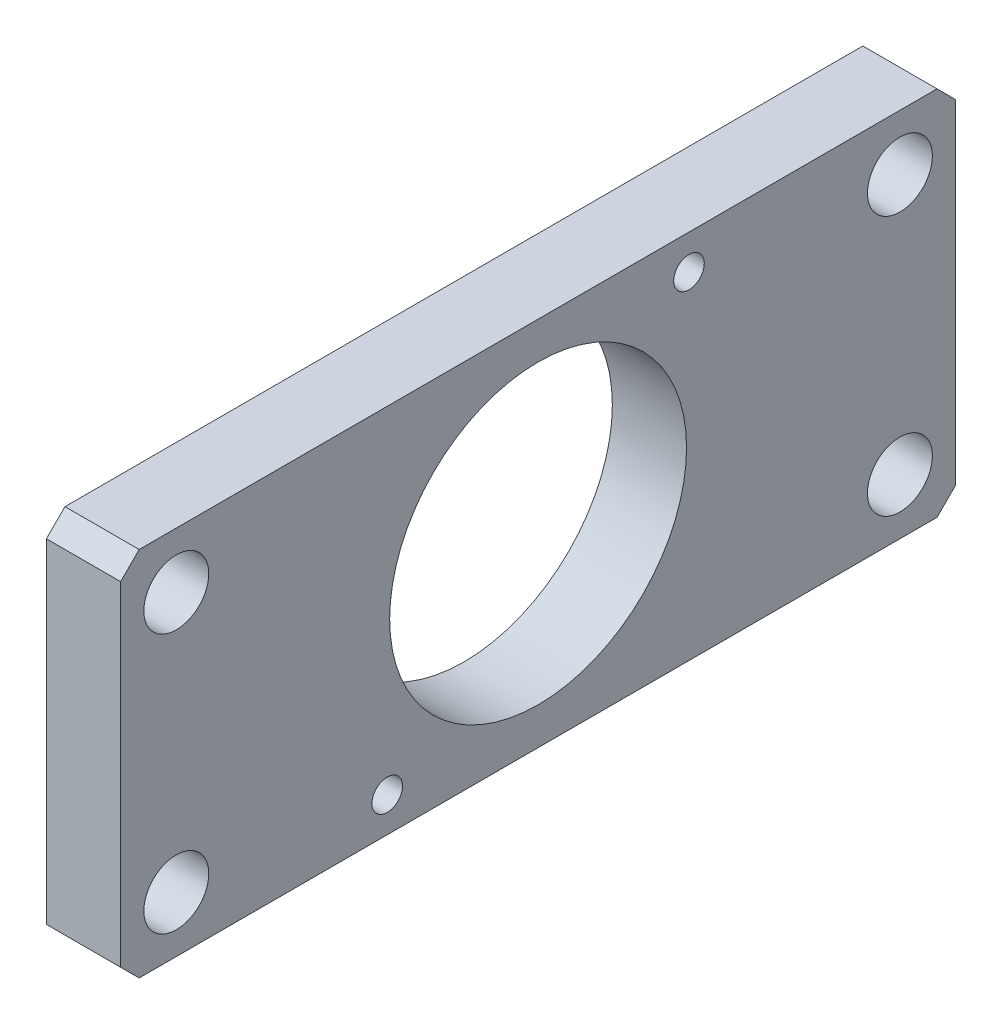
ISO-10303-21;
HEADER;
FILE_DESCRIPTION(('STEP AP214'),'2;1');
FILE_NAME('part.step','',(''),(''),'','','');
FILE_SCHEMA(('AUTOMOTIVE_DESIGN { 1 0 10303 214 1 1 1 1 }'));
ENDSEC;
DATA;
#1=APPLICATION_CONTEXT('core data for automotive mechanical design processes');
#2=APPLICATION_PROTOCOL_DEFINITION('international standard','automotive_design',2000,#1);
#3=PRODUCT_CONTEXT('',#1,'mechanical');
#4=PRODUCT('Part','Part','',(#3));
#5=PRODUCT_RELATED_PRODUCT_CATEGORY('part','',(#4));
#6=PRODUCT_DEFINITION_FORMATION('','',#4);
#7=PRODUCT_DEFINITION_CONTEXT('part definition',#1,'design');
#8=PRODUCT_DEFINITION('design','',#6,#7);
#9=PRODUCT_DEFINITION_SHAPE('','',#8);
#10=(LENGTH_UNIT() NAMED_UNIT(*) SI_UNIT(.MILLI.,.METRE.));
#11=(NAMED_UNIT(*) PLANE_ANGLE_UNIT() SI_UNIT($,.RADIAN.));
#12=(NAMED_UNIT(*) SI_UNIT($,.STERADIAN.) SOLID_ANGLE_UNIT());
#13=UNCERTAINTY_MEASURE_WITH_UNIT(LENGTH_MEASURE(1.E-05),#10,'distance_accuracy_value','');
#14=(GEOMETRIC_REPRESENTATION_CONTEXT(3) GLOBAL_UNCERTAINTY_ASSIGNED_CONTEXT((#13)) GLOBAL_UNIT_ASSIGNED_CONTEXT((#10,
#11,#12)) REPRESENTATION_CONTEXT('',''));
#15=CARTESIAN_POINT('',(0.,0.,0.));
#16=DIRECTION('',(0.,0.,1.));
#17=DIRECTION('',(1.,0.,0.));
#18=AXIS2_PLACEMENT_3D('',#15,#16,#17);
#19=CARTESIAN_POINT('',(8.,0.,-45.));
#20=DIRECTION('',(0.,0.,1.));
#21=DIRECTION('',(0.,-1.,0.));
#22=AXIS2_PLACEMENT_3D('',#19,#20,#21);
#23=PLANE('',#22);
#24=DIRECTION('',(0.,1.,0.));
#25=VECTOR('',#24,1.);
#26=CARTESIAN_POINT('',(8.,0.,-45.));
#27=LINE('',#26,#25);
#28=CARTESIAN_POINT('',(8.,2.,-45.));
#29=VERTEX_POINT('',#28);
#30=CARTESIAN_POINT('',(8.,38.,-45.));
#31=VERTEX_POINT('',#30);
#32=EDGE_CURVE('E126',#29,#31,#27,.T.);
#33=ORIENTED_EDGE('',*,*,#32,.F.);
#34=DIRECTION('',(-1.,0.,0.));
#35=VECTOR('',#34,1.);
#36=CARTESIAN_POINT('',(8.,2.,-45.));
#37=LINE('',#36,#35);
#38=CARTESIAN_POINT('',(0.,2.,-45.));
#39=VERTEX_POINT('',#38);
#40=EDGE_CURVE('E165',#29,#39,#37,.T.);
#41=ORIENTED_EDGE('',*,*,#40,.T.);
#42=DIRECTION('',(0.,1.,0.));
#43=VECTOR('',#42,1.);
#44=CARTESIAN_POINT('',(0.,0.,-45.));
#45=LINE('',#44,#43);
#46=CARTESIAN_POINT('',(0.,38.,-45.));
#47=VERTEX_POINT('',#46);
#48=EDGE_CURVE('E171',#39,#47,#45,.T.);
#49=ORIENTED_EDGE('',*,*,#48,.T.);
#50=DIRECTION('',(1.,0.,0.));
#51=VECTOR('',#50,1.);
#52=CARTESIAN_POINT('',(8.,38.,-45.));
#53=LINE('',#52,#51);
#54=EDGE_CURVE('E163',#47,#31,#53,.T.);
#55=ORIENTED_EDGE('',*,*,#54,.T.);
#56=EDGE_LOOP('',(#33,#41,#49,#55));
#57=FACE_BOUND('',#56,.T.);
#58=ADVANCED_FACE('F34',(#57),#23,.F.);
#59=CARTESIAN_POINT('',(8.,40.,-45.));
#60=DIRECTION('',(0.,-1.,0.));
#61=DIRECTION('',(0.,0.,-1.));
#62=AXIS2_PLACEMENT_3D('',#59,#60,#61);
#63=PLANE('',#62);
#64=DIRECTION('',(0.,0.,1.));
#65=VECTOR('',#64,1.);
#66=CARTESIAN_POINT('',(8.,40.,-45.));
#67=LINE('',#66,#65);
#68=CARTESIAN_POINT('',(8.,40.,-43.));
#69=VERTEX_POINT('',#68);
#70=CARTESIAN_POINT('',(8.,40.,43.));
#71=VERTEX_POINT('',#70);
#72=EDGE_CURVE('E129',#69,#71,#67,.T.);
#73=ORIENTED_EDGE('',*,*,#72,.F.);
#74=DIRECTION('',(-1.,0.,0.));
#75=VECTOR('',#74,1.);
#76=CARTESIAN_POINT('',(8.,40.,-43.));
#77=LINE('',#76,#75);
#78=CARTESIAN_POINT('',(0.,40.,-43.));
#79=VERTEX_POINT('',#78);
#80=EDGE_CURVE('E11',#69,#79,#77,.T.);
#81=ORIENTED_EDGE('',*,*,#80,.T.);
#82=DIRECTION('',(0.,0.,1.));
#83=VECTOR('',#82,1.);
#84=CARTESIAN_POINT('',(0.,40.,-45.));
#85=LINE('',#84,#83);
#86=CARTESIAN_POINT('',(0.,40.,43.));
#87=VERTEX_POINT('',#86);
#88=EDGE_CURVE('E131',#79,#87,#85,.T.);
#89=ORIENTED_EDGE('',*,*,#88,.T.);
#90=DIRECTION('',(1.,0.,0.));
#91=VECTOR('',#90,1.);
#92=CARTESIAN_POINT('',(8.,40.,43.));
#93=LINE('',#92,#91);
#94=EDGE_CURVE('E42',#87,#71,#93,.T.);
#95=ORIENTED_EDGE('',*,*,#94,.T.);
#96=EDGE_LOOP('',(#73,#81,#89,#95));
#97=FACE_BOUND('',#96,.T.);
#98=ADVANCED_FACE('F236',(#97),#63,.F.);
#99=CARTESIAN_POINT('',(8.,0.,45.));
#100=DIRECTION('',(0.,0.,-1.));
#101=DIRECTION('',(0.,1.,0.));
#102=AXIS2_PLACEMENT_3D('',#99,#100,#101);
#103=PLANE('',#102);
#104=DIRECTION('',(0.,-1.,0.));
#105=VECTOR('',#104,1.);
#106=CARTESIAN_POINT('',(0.,0.,45.));
#107=LINE('',#106,#105);
#108=CARTESIAN_POINT('',(0.,38.,45.));
#109=VERTEX_POINT('',#108);
#110=CARTESIAN_POINT('',(0.,1.99999999999999,45.));
#111=VERTEX_POINT('',#110);
#112=EDGE_CURVE('E127',#109,#111,#107,.T.);
#113=ORIENTED_EDGE('',*,*,#112,.T.);
#114=DIRECTION('',(1.,0.,0.));
#115=VECTOR('',#114,1.);
#116=CARTESIAN_POINT('',(8.,1.99999999999999,45.));
#117=LINE('',#116,#115);
#118=CARTESIAN_POINT('',(8.,1.99999999999999,45.));
#119=VERTEX_POINT('',#118);
#120=EDGE_CURVE('E105',#111,#119,#117,.T.);
#121=ORIENTED_EDGE('',*,*,#120,.T.);
#122=DIRECTION('',(0.,-1.,0.));
#123=VECTOR('',#122,1.);
#124=CARTESIAN_POINT('',(8.,0.,45.));
#125=LINE('',#124,#123);
#126=CARTESIAN_POINT('',(8.,38.,45.));
#127=VERTEX_POINT('',#126);
#128=EDGE_CURVE('E183',#127,#119,#125,.T.);
#129=ORIENTED_EDGE('',*,*,#128,.F.);
#130=DIRECTION('',(-1.,0.,0.));
#131=VECTOR('',#130,1.);
#132=CARTESIAN_POINT('',(8.,38.,45.));
#133=LINE('',#132,#131);
#134=EDGE_CURVE('E110',#127,#109,#133,.T.);
#135=ORIENTED_EDGE('',*,*,#134,.T.);
#136=EDGE_LOOP('',(#113,#121,#129,#135));
#137=FACE_BOUND('',#136,.T.);
#138=ADVANCED_FACE('F234',(#137),#103,.F.);
#139=CARTESIAN_POINT('',(8.,0.,-45.));
#140=DIRECTION('',(0.,1.,0.));
#141=DIRECTION('',(0.,0.,1.));
#142=AXIS2_PLACEMENT_3D('',#139,#140,#141);
#143=PLANE('',#142);
#144=DIRECTION('',(0.,0.,-1.));
#145=VECTOR('',#144,1.);
#146=CARTESIAN_POINT('',(8.,0.,-45.));
#147=LINE('',#146,#145);
#148=CARTESIAN_POINT('',(8.,0.,43.));
#149=VERTEX_POINT('',#148);
#150=CARTESIAN_POINT('',(8.,0.,-43.));
#151=VERTEX_POINT('',#150);
#152=EDGE_CURVE('E120',#149,#151,#147,.T.);
#153=ORIENTED_EDGE('',*,*,#152,.F.);
#154=DIRECTION('',(-1.,0.,0.));
#155=VECTOR('',#154,1.);
#156=CARTESIAN_POINT('',(8.,0.,43.));
#157=LINE('',#156,#155);
#158=CARTESIAN_POINT('',(0.,0.,43.));
#159=VERTEX_POINT('',#158);
#160=EDGE_CURVE('E104',#149,#159,#157,.T.);
#161=ORIENTED_EDGE('',*,*,#160,.T.);
#162=DIRECTION('',(0.,0.,-1.));
#163=VECTOR('',#162,1.);
#164=CARTESIAN_POINT('',(0.,0.,-45.));
#165=LINE('',#164,#163);
#166=CARTESIAN_POINT('',(0.,0.,-43.));
#167=VERTEX_POINT('',#166);
#168=EDGE_CURVE('E117',#159,#167,#165,.T.);
#169=ORIENTED_EDGE('',*,*,#168,.T.);
#170=DIRECTION('',(1.,0.,0.));
#171=VECTOR('',#170,1.);
#172=CARTESIAN_POINT('',(8.,0.,-43.));
#173=LINE('',#172,#171);
#174=EDGE_CURVE('E122',#167,#151,#173,.T.);
#175=ORIENTED_EDGE('',*,*,#174,.T.);
#176=EDGE_LOOP('',(#153,#161,#169,#175));
#177=FACE_BOUND('',#176,.T.);
#178=ADVANCED_FACE('F116',(#177),#143,.F.);
#179=CARTESIAN_POINT('',(8.,40.,-45.));
#180=DIRECTION('',(1.,0.,0.));
#181=DIRECTION('',(0.,0.,-1.));
#182=AXIS2_PLACEMENT_3D('',#179,#180,#181);
#183=PLANE('',#182);
#184=CARTESIAN_POINT('',(8.,36.2634559672907,-16.2634559672905));
#185=DIRECTION('',(1.,0.,0.));
#186=DIRECTION('',(0.,0.,-1.));
#187=AXIS2_PLACEMENT_3D('',#184,#185,#186);
#188=CIRCLE('',#187,1.64999999999999);
#189=CARTESIAN_POINT('',(8.,36.2634559672907,-17.9134559672905));
#190=VERTEX_POINT('',#189);
#191=EDGE_CURVE('E209',#190,#190,#188,.T.);
#192=ORIENTED_EDGE('',*,*,#191,.F.);
#193=EDGE_LOOP('',(#192));
#194=FACE_BOUND('',#193,.T.);
#195=CARTESIAN_POINT('',(8.,3.7365440327093,16.2634559672905));
#196=DIRECTION('',(1.,0.,0.));
#197=DIRECTION('',(0.,0.,-1.));
#198=AXIS2_PLACEMENT_3D('',#195,#196,#197);
#199=CIRCLE('',#198,1.64999999999999);
#200=CARTESIAN_POINT('',(8.,3.7365440327093,14.6134559672905));
#201=VERTEX_POINT('',#200);
#202=EDGE_CURVE('E203',#201,#201,#199,.T.);
#203=ORIENTED_EDGE('',*,*,#202,.F.);
#204=EDGE_LOOP('',(#203));
#205=FACE_BOUND('',#204,.T.);
#206=CARTESIAN_POINT('',(8.,5.99999999999998,39.));
#207=DIRECTION('',(1.,0.,0.));
#208=DIRECTION('',(0.,0.,-1.));
#209=AXIS2_PLACEMENT_3D('',#206,#207,#208);
#210=CIRCLE('',#209,3.49999999999999);
#211=CARTESIAN_POINT('',(8.,5.99999999999998,35.5));
#212=VERTEX_POINT('',#211);
#213=EDGE_CURVE('E147',#212,#212,#210,.T.);
#214=ORIENTED_EDGE('',*,*,#213,.F.);
#215=EDGE_LOOP('',(#214));
#216=FACE_BOUND('',#215,.T.);
#217=CARTESIAN_POINT('',(8.,5.99999999999999,-39.));
#218=DIRECTION('',(1.,0.,0.));
#219=DIRECTION('',(0.,0.,-1.));
#220=AXIS2_PLACEMENT_3D('',#217,#218,#219);
#221=CIRCLE('',#220,3.49999999999999);
#222=CARTESIAN_POINT('',(8.,5.99999999999999,-42.5));
#223=VERTEX_POINT('',#222);
#224=EDGE_CURVE('E143',#223,#223,#221,.T.);
#225=ORIENTED_EDGE('',*,*,#224,.F.);
#226=EDGE_LOOP('',(#225));
#227=FACE_BOUND('',#226,.T.);
#228=CARTESIAN_POINT('',(8.,34.,-39.));
#229=DIRECTION('',(1.,0.,0.));
#230=DIRECTION('',(0.,0.,-1.));
#231=AXIS2_PLACEMENT_3D('',#228,#229,#230);
#232=CIRCLE('',#231,3.49999999999999);
#233=CARTESIAN_POINT('',(8.,34.,-42.5));
#234=VERTEX_POINT('',#233);
#235=EDGE_CURVE('E139',#234,#234,#232,.T.);
#236=ORIENTED_EDGE('',*,*,#235,.F.);
#237=EDGE_LOOP('',(#236));
#238=FACE_BOUND('',#237,.T.);
#239=CARTESIAN_POINT('',(8.,34.,39.));
#240=DIRECTION('',(1.,0.,0.));
#241=DIRECTION('',(0.,0.,-1.));
#242=AXIS2_PLACEMENT_3D('',#239,#240,#241);
#243=CIRCLE('',#242,3.49999999999999);
#244=CARTESIAN_POINT('',(8.,34.,35.5));
#245=VERTEX_POINT('',#244);
#246=EDGE_CURVE('E138',#245,#245,#243,.T.);
#247=ORIENTED_EDGE('',*,*,#246,.F.);
#248=EDGE_LOOP('',(#247));
#249=FACE_BOUND('',#248,.T.);
#250=CARTESIAN_POINT('',(8.,20.,0.));
#251=DIRECTION('',(1.,0.,0.));
#252=DIRECTION('',(0.,0.,-1.));
#253=AXIS2_PLACEMENT_3D('',#250,#251,#252);
#254=CIRCLE('',#253,16.);
#255=CARTESIAN_POINT('',(8.,20.,-16.));
#256=VERTEX_POINT('',#255);
#257=EDGE_CURVE('E179',#256,#256,#254,.T.);
#258=ORIENTED_EDGE('',*,*,#257,.F.);
#259=EDGE_LOOP('',(#258));
#260=FACE_BOUND('',#259,.T.);
#261=ORIENTED_EDGE('',*,*,#128,.T.);
#262=DIRECTION('',(0.,0.707106781186548,0.707106781186548));
#263=VECTOR('',#262,1.);
#264=CARTESIAN_POINT('',(8.,-24.,19.));
#265=LINE('',#264,#263);
#266=EDGE_CURVE('E161',#119,#149,#265,.F.);
#267=ORIENTED_EDGE('',*,*,#266,.T.);
#268=ORIENTED_EDGE('',*,*,#152,.T.);
#269=DIRECTION('',(0.,-0.707106781186547,0.707106781186548));
#270=VECTOR('',#269,1.);
#271=CARTESIAN_POINT('',(8.,21.,-64.));
#272=LINE('',#271,#270);
#273=EDGE_CURVE('E159',#151,#29,#272,.F.);
#274=ORIENTED_EDGE('',*,*,#273,.T.);
#275=ORIENTED_EDGE('',*,*,#32,.T.);
#276=DIRECTION('',(0.,-0.707106781186548,-0.707106781186548));
#277=VECTOR('',#276,1.);
#278=CARTESIAN_POINT('',(8.,39.,-44.));
#279=LINE('',#278,#277);
#280=EDGE_CURVE('E55',#31,#69,#279,.F.);
#281=ORIENTED_EDGE('',*,*,#280,.T.);
#282=ORIENTED_EDGE('',*,*,#72,.T.);
#283=DIRECTION('',(0.,0.707106781186545,-0.70710678118655));
#284=VECTOR('',#283,1.);
#285=CARTESIAN_POINT('',(8.,84.,-1.00000000000033));
#286=LINE('',#285,#284);
#287=EDGE_CURVE('E156',#71,#127,#286,.F.);
#288=ORIENTED_EDGE('',*,*,#287,.T.);
#289=EDGE_LOOP('',(#261,#267,#268,#274,#275,#281,#282,#288));
#290=FACE_BOUND('',#289,.T.);
#291=ADVANCED_FACE('F215',(#194,#205,#216,#227,#238,#249,#260,#290),#183,.T.);
#292=CARTESIAN_POINT('',(0.,40.,-45.));
#293=DIRECTION('',(1.,0.,0.));
#294=DIRECTION('',(0.,0.,-1.));
#295=AXIS2_PLACEMENT_3D('',#292,#293,#294);
#296=PLANE('',#295);
#297=CARTESIAN_POINT('',(0.,36.2634559672907,-16.2634559672905));
#298=DIRECTION('',(1.,0.,0.));
#299=DIRECTION('',(0.,0.,-1.));
#300=AXIS2_PLACEMENT_3D('',#297,#298,#299);
#301=CIRCLE('',#300,1.65);
#302=CARTESIAN_POINT('',(0.,36.2634559672907,-17.9134559672905));
#303=VERTEX_POINT('',#302);
#304=EDGE_CURVE('E206',#303,#303,#301,.T.);
#305=ORIENTED_EDGE('',*,*,#304,.T.);
#306=EDGE_LOOP('',(#305));
#307=FACE_BOUND('',#306,.T.);
#308=CARTESIAN_POINT('',(0.,3.7365440327093,16.2634559672905));
#309=DIRECTION('',(1.,0.,0.));
#310=DIRECTION('',(0.,0.,-1.));
#311=AXIS2_PLACEMENT_3D('',#308,#309,#310);
#312=CIRCLE('',#311,1.65);
#313=CARTESIAN_POINT('',(0.,3.7365440327093,14.6134559672905));
#314=VERTEX_POINT('',#313);
#315=EDGE_CURVE('E200',#314,#314,#312,.T.);
#316=ORIENTED_EDGE('',*,*,#315,.T.);
#317=EDGE_LOOP('',(#316));
#318=FACE_BOUND('',#317,.T.);
#319=CARTESIAN_POINT('',(0.,5.99999999999998,39.));
#320=DIRECTION('',(1.,0.,0.));
#321=DIRECTION('',(0.,0.,-1.));
#322=AXIS2_PLACEMENT_3D('',#319,#320,#321);
#323=CIRCLE('',#322,3.49999999999998);
#324=CARTESIAN_POINT('',(0.,5.99999999999998,35.5));
#325=VERTEX_POINT('',#324);
#326=EDGE_CURVE('E144',#325,#325,#323,.T.);
#327=ORIENTED_EDGE('',*,*,#326,.T.);
#328=EDGE_LOOP('',(#327));
#329=FACE_BOUND('',#328,.T.);
#330=CARTESIAN_POINT('',(0.,5.99999999999999,-39.));
#331=DIRECTION('',(1.,0.,0.));
#332=DIRECTION('',(0.,0.,-1.));
#333=AXIS2_PLACEMENT_3D('',#330,#331,#332);
#334=CIRCLE('',#333,3.49999999999998);
#335=CARTESIAN_POINT('',(0.,5.99999999999999,-42.5));
#336=VERTEX_POINT('',#335);
#337=EDGE_CURVE('E140',#336,#336,#334,.T.);
#338=ORIENTED_EDGE('',*,*,#337,.T.);
#339=EDGE_LOOP('',(#338));
#340=FACE_BOUND('',#339,.T.);
#341=CARTESIAN_POINT('',(0.,34.,-39.));
#342=DIRECTION('',(1.,0.,0.));
#343=DIRECTION('',(0.,0.,-1.));
#344=AXIS2_PLACEMENT_3D('',#341,#342,#343);
#345=CIRCLE('',#344,3.49999999999999);
#346=CARTESIAN_POINT('',(0.,34.,-42.5));
#347=VERTEX_POINT('',#346);
#348=EDGE_CURVE('E135',#347,#347,#345,.T.);
#349=ORIENTED_EDGE('',*,*,#348,.T.);
#350=EDGE_LOOP('',(#349));
#351=FACE_BOUND('',#350,.T.);
#352=CARTESIAN_POINT('',(0.,34.,39.));
#353=DIRECTION('',(1.,0.,0.));
#354=DIRECTION('',(0.,0.,-1.));
#355=AXIS2_PLACEMENT_3D('',#352,#353,#354);
#356=CIRCLE('',#355,3.49999999999999);
#357=CARTESIAN_POINT('',(0.,34.,35.5));
#358=VERTEX_POINT('',#357);
#359=EDGE_CURVE('E188',#358,#358,#356,.T.);
#360=ORIENTED_EDGE('',*,*,#359,.T.);
#361=EDGE_LOOP('',(#360));
#362=FACE_BOUND('',#361,.T.);
#363=CARTESIAN_POINT('',(0.,20.,0.));
#364=DIRECTION('',(1.,0.,0.));
#365=DIRECTION('',(0.,0.,-1.));
#366=AXIS2_PLACEMENT_3D('',#363,#364,#365);
#367=CIRCLE('',#366,16.);
#368=CARTESIAN_POINT('',(0.,20.,-16.));
#369=VERTEX_POINT('',#368);
#370=EDGE_CURVE('E176',#369,#369,#367,.T.);
#371=ORIENTED_EDGE('',*,*,#370,.T.);
#372=EDGE_LOOP('',(#371));
#373=FACE_BOUND('',#372,.T.);
#374=ORIENTED_EDGE('',*,*,#168,.F.);
#375=DIRECTION('',(0.,-0.707106781186548,-0.707106781186548));
#376=VECTOR('',#375,1.);
#377=CARTESIAN_POINT('',(0.,0.,43.));
#378=LINE('',#377,#376);
#379=EDGE_CURVE('E100',#159,#111,#378,.F.);
#380=ORIENTED_EDGE('',*,*,#379,.T.);
#381=ORIENTED_EDGE('',*,*,#112,.F.);
#382=DIRECTION('',(0.,-0.707106781186545,0.70710678118655));
#383=VECTOR('',#382,1.);
#384=CARTESIAN_POINT('',(0.,38.,45.));
#385=LINE('',#384,#383);
#386=EDGE_CURVE('E121',#109,#87,#385,.F.);
#387=ORIENTED_EDGE('',*,*,#386,.T.);
#388=ORIENTED_EDGE('',*,*,#88,.F.);
#389=DIRECTION('',(0.,0.707106781186548,0.707106781186548));
#390=VECTOR('',#389,1.);
#391=CARTESIAN_POINT('',(0.,40.,-43.));
#392=LINE('',#391,#390);
#393=EDGE_CURVE('E150',#79,#47,#392,.F.);
#394=ORIENTED_EDGE('',*,*,#393,.T.);
#395=ORIENTED_EDGE('',*,*,#48,.F.);
#396=DIRECTION('',(0.,0.707106781186547,-0.707106781186548));
#397=VECTOR('',#396,1.);
#398=CARTESIAN_POINT('',(0.,2.,-45.));
#399=LINE('',#398,#397);
#400=EDGE_CURVE('E111',#39,#167,#399,.F.);
#401=ORIENTED_EDGE('',*,*,#400,.T.);
#402=EDGE_LOOP('',(#374,#380,#381,#387,#388,#394,#395,#401));
#403=FACE_BOUND('',#402,.T.);
#404=ADVANCED_FACE('F124',(#307,#318,#329,#340,#351,#362,#373,#403),#296,.F.);
#405=CARTESIAN_POINT('',(0.,20.,0.));
#406=DIRECTION('',(1.,0.,0.));
#407=DIRECTION('',(0.,0.,-1.));
#408=AXIS2_PLACEMENT_3D('',#405,#406,#407);
#409=CYLINDRICAL_SURFACE('',#408,16.);
#410=ORIENTED_EDGE('',*,*,#370,.F.);
#411=EDGE_LOOP('',(#410));
#412=FACE_BOUND('',#411,.T.);
#413=ORIENTED_EDGE('',*,*,#257,.T.);
#414=EDGE_LOOP('',(#413));
#415=FACE_BOUND('',#414,.T.);
#416=ADVANCED_FACE('F260',(#412,#415),#409,.F.);
#417=CARTESIAN_POINT('',(8.,34.,39.));
#418=DIRECTION('',(1.,0.,0.));
#419=DIRECTION('',(0.,0.,-1.));
#420=AXIS2_PLACEMENT_3D('',#417,#418,#419);
#421=CYLINDRICAL_SURFACE('',#420,3.49999999999999);
#422=ORIENTED_EDGE('',*,*,#246,.T.);
#423=EDGE_LOOP('',(#422));
#424=FACE_BOUND('',#423,.T.);
#425=ORIENTED_EDGE('',*,*,#359,.F.);
#426=EDGE_LOOP('',(#425));
#427=FACE_BOUND('',#426,.T.);
#428=ADVANCED_FACE('F265',(#424,#427),#421,.F.);
#429=CARTESIAN_POINT('',(8.,34.,-39.));
#430=DIRECTION('',(1.,0.,0.));
#431=DIRECTION('',(0.,0.,-1.));
#432=AXIS2_PLACEMENT_3D('',#429,#430,#431);
#433=CYLINDRICAL_SURFACE('',#432,3.49999999999999);
#434=ORIENTED_EDGE('',*,*,#235,.T.);
#435=EDGE_LOOP('',(#434));
#436=FACE_BOUND('',#435,.T.);
#437=ORIENTED_EDGE('',*,*,#348,.F.);
#438=EDGE_LOOP('',(#437));
#439=FACE_BOUND('',#438,.T.);
#440=ADVANCED_FACE('F269',(#436,#439),#433,.F.);
#441=CARTESIAN_POINT('',(8.,5.99999999999999,-39.));
#442=DIRECTION('',(1.,0.,0.));
#443=DIRECTION('',(0.,0.,-1.));
#444=AXIS2_PLACEMENT_3D('',#441,#442,#443);
#445=CYLINDRICAL_SURFACE('',#444,3.49999999999998);
#446=ORIENTED_EDGE('',*,*,#224,.T.);
#447=EDGE_LOOP('',(#446));
#448=FACE_BOUND('',#447,.T.);
#449=ORIENTED_EDGE('',*,*,#337,.F.);
#450=EDGE_LOOP('',(#449));
#451=FACE_BOUND('',#450,.T.);
#452=ADVANCED_FACE('F273',(#448,#451),#445,.F.);
#453=CARTESIAN_POINT('',(8.,5.99999999999998,39.));
#454=DIRECTION('',(1.,0.,0.));
#455=DIRECTION('',(0.,0.,-1.));
#456=AXIS2_PLACEMENT_3D('',#453,#454,#455);
#457=CYLINDRICAL_SURFACE('',#456,3.49999999999998);
#458=ORIENTED_EDGE('',*,*,#213,.T.);
#459=EDGE_LOOP('',(#458));
#460=FACE_BOUND('',#459,.T.);
#461=ORIENTED_EDGE('',*,*,#326,.F.);
#462=EDGE_LOOP('',(#461));
#463=FACE_BOUND('',#462,.T.);
#464=ADVANCED_FACE('F277',(#460,#463),#457,.F.);
#465=CARTESIAN_POINT('',(8.,3.7365440327093,16.2634559672905));
#466=DIRECTION('',(1.,0.,0.));
#467=DIRECTION('',(0.,0.,-1.));
#468=AXIS2_PLACEMENT_3D('',#465,#466,#467);
#469=CYLINDRICAL_SURFACE('',#468,1.64999999999999);
#470=ORIENTED_EDGE('',*,*,#315,.F.);
#471=EDGE_LOOP('',(#470));
#472=FACE_BOUND('',#471,.T.);
#473=ORIENTED_EDGE('',*,*,#202,.T.);
#474=EDGE_LOOP('',(#473));
#475=FACE_BOUND('',#474,.T.);
#476=ADVANCED_FACE('F281',(#472,#475),#469,.F.);
#477=CARTESIAN_POINT('',(8.,36.2634559672907,-16.2634559672905));
#478=DIRECTION('',(1.,0.,0.));
#479=DIRECTION('',(0.,0.,-1.));
#480=AXIS2_PLACEMENT_3D('',#477,#478,#479);
#481=CYLINDRICAL_SURFACE('',#480,1.65);
#482=ORIENTED_EDGE('',*,*,#304,.F.);
#483=EDGE_LOOP('',(#482));
#484=FACE_BOUND('',#483,.T.);
#485=ORIENTED_EDGE('',*,*,#191,.T.);
#486=EDGE_LOOP('',(#485));
#487=FACE_BOUND('',#486,.T.);
#488=ADVANCED_FACE('F213',(#484,#487),#481,.F.);
#489=CARTESIAN_POINT('',(8.,0.,43.));
#490=DIRECTION('',(0.,0.707106781186547,-0.707106781186547));
#491=DIRECTION('',(0.,0.707106781186548,0.707106781186548));
#492=AXIS2_PLACEMENT_3D('',#489,#490,#491);
#493=PLANE('',#492);
#494=ORIENTED_EDGE('',*,*,#266,.F.);
#495=ORIENTED_EDGE('',*,*,#120,.F.);
#496=ORIENTED_EDGE('',*,*,#379,.F.);
#497=ORIENTED_EDGE('',*,*,#160,.F.);
#498=EDGE_LOOP('',(#494,#495,#496,#497));
#499=FACE_BOUND('',#498,.T.);
#500=ADVANCED_FACE('F103',(#499),#493,.F.);
#501=CARTESIAN_POINT('',(8.,2.,-45.));
#502=DIRECTION('',(0.,0.707106781186548,0.707106781186547));
#503=DIRECTION('',(0.,-0.707106781186547,0.707106781186548));
#504=AXIS2_PLACEMENT_3D('',#501,#502,#503);
#505=PLANE('',#504);
#506=ORIENTED_EDGE('',*,*,#273,.F.);
#507=ORIENTED_EDGE('',*,*,#174,.F.);
#508=ORIENTED_EDGE('',*,*,#400,.F.);
#509=ORIENTED_EDGE('',*,*,#40,.F.);
#510=EDGE_LOOP('',(#506,#507,#508,#509));
#511=FACE_BOUND('',#510,.T.);
#512=ADVANCED_FACE('F240',(#511),#505,.F.);
#513=CARTESIAN_POINT('',(8.,40.,-43.));
#514=DIRECTION('',(0.,-0.707106781186547,0.707106781186547));
#515=DIRECTION('',(0.,-0.707106781186548,-0.707106781186548));
#516=AXIS2_PLACEMENT_3D('',#513,#514,#515);
#517=PLANE('',#516);
#518=ORIENTED_EDGE('',*,*,#280,.F.);
#519=ORIENTED_EDGE('',*,*,#54,.F.);
#520=ORIENTED_EDGE('',*,*,#393,.F.);
#521=ORIENTED_EDGE('',*,*,#80,.F.);
#522=EDGE_LOOP('',(#518,#519,#520,#521));
#523=FACE_BOUND('',#522,.T.);
#524=ADVANCED_FACE('F239',(#523),#517,.F.);
#525=CARTESIAN_POINT('',(8.,38.,45.));
#526=DIRECTION('',(0.,-0.70710678118655,-0.707106781186545));
#527=DIRECTION('',(0.,0.707106781186545,-0.70710678118655));
#528=AXIS2_PLACEMENT_3D('',#525,#526,#527);
#529=PLANE('',#528);
#530=ORIENTED_EDGE('',*,*,#287,.F.);
#531=ORIENTED_EDGE('',*,*,#94,.F.);
#532=ORIENTED_EDGE('',*,*,#386,.F.);
#533=ORIENTED_EDGE('',*,*,#134,.F.);
#534=EDGE_LOOP('',(#530,#531,#532,#533));
#535=FACE_BOUND('',#534,.T.);
#536=ADVANCED_FACE('F36',(#535),#529,.F.);
#537=CLOSED_SHELL('',(#58,#98,#138,#178,#291,#404,#416,#428,#440,#452,#464,#476,#488,#500,#512,
#524,#536));
#538=MANIFOLD_SOLID_BREP('B2',#537);
#539=ADVANCED_BREP_SHAPE_REPRESENTATION('',(#18,#538),#14);
#540=SHAPE_DEFINITION_REPRESENTATION(#9,#539);
ENDSEC;
END-ISO-10303-21;
